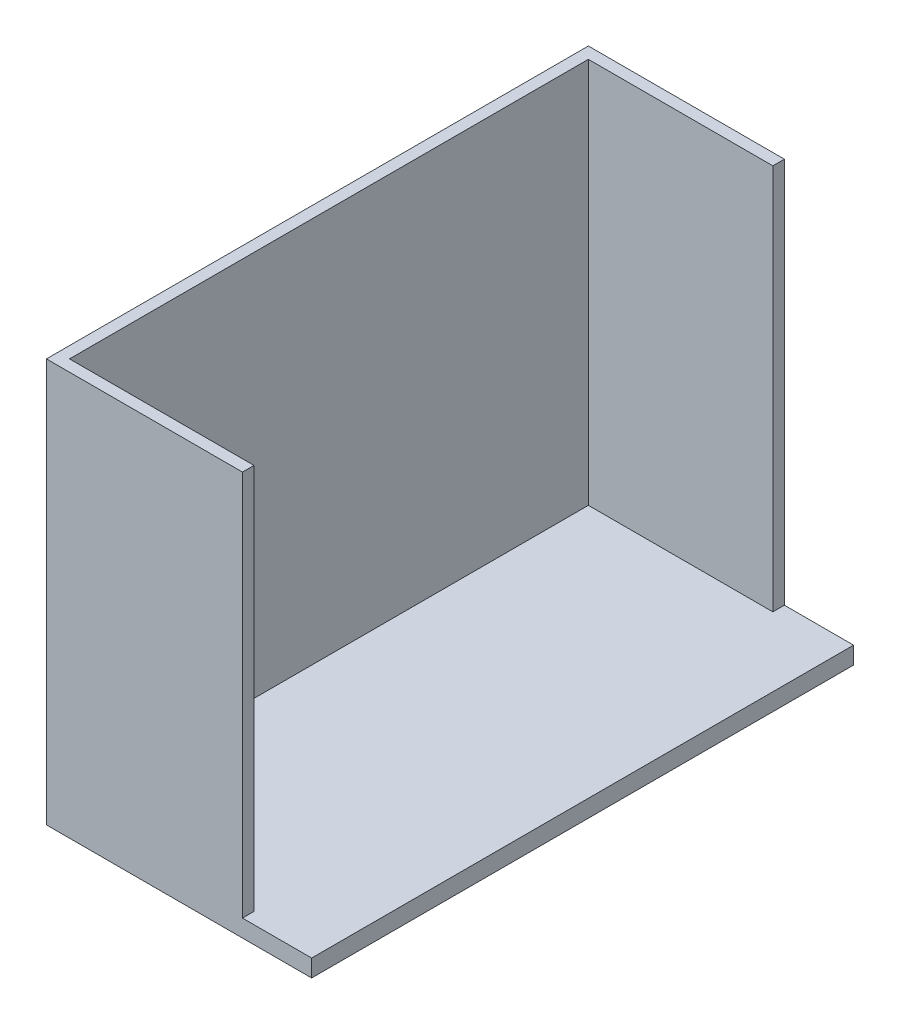
ISO-10303-21;
HEADER;
FILE_DESCRIPTION(('STEP AP214'),'2;1');
FILE_NAME('part.step','',(''),(''),'','','');
FILE_SCHEMA(('AUTOMOTIVE_DESIGN { 1 0 10303 214 1 1 1 1 }'));
ENDSEC;
DATA;
#1=APPLICATION_CONTEXT('core data for automotive mechanical design processes');
#2=APPLICATION_PROTOCOL_DEFINITION('international standard','automotive_design',2000,#1);
#3=PRODUCT_CONTEXT('',#1,'mechanical');
#4=PRODUCT('Part','Part','',(#3));
#5=PRODUCT_RELATED_PRODUCT_CATEGORY('part','',(#4));
#6=PRODUCT_DEFINITION_FORMATION('','',#4);
#7=PRODUCT_DEFINITION_CONTEXT('part definition',#1,'design');
#8=PRODUCT_DEFINITION('design','',#6,#7);
#9=PRODUCT_DEFINITION_SHAPE('','',#8);
#10=(LENGTH_UNIT() NAMED_UNIT(*) SI_UNIT(.MILLI.,.METRE.));
#11=(NAMED_UNIT(*) PLANE_ANGLE_UNIT() SI_UNIT($,.RADIAN.));
#12=(NAMED_UNIT(*) SI_UNIT($,.STERADIAN.) SOLID_ANGLE_UNIT());
#13=UNCERTAINTY_MEASURE_WITH_UNIT(LENGTH_MEASURE(1.E-05),#10,'distance_accuracy_value','');
#14=(GEOMETRIC_REPRESENTATION_CONTEXT(3) GLOBAL_UNCERTAINTY_ASSIGNED_CONTEXT((#13)) GLOBAL_UNIT_ASSIGNED_CONTEXT((#10,
#11,#12)) REPRESENTATION_CONTEXT('',''));
#15=CARTESIAN_POINT('',(0.,0.,0.));
#16=DIRECTION('',(0.,0.,1.));
#17=DIRECTION('',(1.,0.,0.));
#18=AXIS2_PLACEMENT_3D('',#15,#16,#17);
#19=CARTESIAN_POINT('',(0.,19.05,0.));
#20=DIRECTION('',(0.,-1.,0.));
#21=DIRECTION('',(0.,0.,-1.));
#22=AXIS2_PLACEMENT_3D('',#19,#20,#21);
#23=PLANE('',#22);
#24=DIRECTION('',(0.,0.,-1.));
#25=VECTOR('',#24,1.);
#26=CARTESIAN_POINT('',(69.85,19.05,-298.45));
#27=LINE('',#26,#25);
#28=CARTESIAN_POINT('',(69.85,19.05,-285.75));
#29=VERTEX_POINT('',#28);
#30=CARTESIAN_POINT('',(69.85,19.05,-298.45));
#31=VERTEX_POINT('',#30);
#32=EDGE_CURVE('E48',#29,#31,#27,.T.);
#33=ORIENTED_EDGE('',*,*,#32,.F.);
#34=DIRECTION('',(1.,0.,0.));
#35=VECTOR('',#34,1.);
#36=CARTESIAN_POINT('',(69.85,19.05,-285.75));
#37=LINE('',#36,#35);
#38=CARTESIAN_POINT('',(-133.35,19.05,-285.75));
#39=VERTEX_POINT('',#38);
#40=EDGE_CURVE('E52',#39,#29,#37,.T.);
#41=ORIENTED_EDGE('',*,*,#40,.F.);
#42=DIRECTION('',(0.,0.,-1.));
#43=VECTOR('',#42,1.);
#44=CARTESIAN_POINT('',(-133.35,19.05,-285.75));
#45=LINE('',#44,#43);
#46=CARTESIAN_POINT('',(-133.35,19.05,285.75));
#47=VERTEX_POINT('',#46);
#48=EDGE_CURVE('E175',#47,#39,#45,.T.);
#49=ORIENTED_EDGE('',*,*,#48,.F.);
#50=DIRECTION('',(-1.,0.,0.));
#51=VECTOR('',#50,1.);
#52=CARTESIAN_POINT('',(69.85,19.05,285.75));
#53=LINE('',#52,#51);
#54=CARTESIAN_POINT('',(69.85,19.05,285.75));
#55=VERTEX_POINT('',#54);
#56=EDGE_CURVE('E173',#55,#47,#53,.T.);
#57=ORIENTED_EDGE('',*,*,#56,.F.);
#58=DIRECTION('',(0.,0.,-1.));
#59=VECTOR('',#58,1.);
#60=CARTESIAN_POINT('',(69.85,19.05,298.45));
#61=LINE('',#60,#59);
#62=CARTESIAN_POINT('',(69.85,19.05,298.45));
#63=VERTEX_POINT('',#62);
#64=EDGE_CURVE('E171',#63,#55,#61,.T.);
#65=ORIENTED_EDGE('',*,*,#64,.F.);
#66=DIRECTION('',(1.,0.,0.));
#67=VECTOR('',#66,1.);
#68=CARTESIAN_POINT('',(-146.05,19.05,298.45));
#69=LINE('',#68,#67);
#70=CARTESIAN_POINT('',(146.05,19.05,298.45));
#71=VERTEX_POINT('',#70);
#72=EDGE_CURVE('E133',#63,#71,#69,.T.);
#73=ORIENTED_EDGE('',*,*,#72,.T.);
#74=DIRECTION('',(0.,0.,-1.));
#75=VECTOR('',#74,1.);
#76=CARTESIAN_POINT('',(146.05,19.05,298.45));
#77=LINE('',#76,#75);
#78=CARTESIAN_POINT('',(146.05,19.05,-298.45));
#79=VERTEX_POINT('',#78);
#80=EDGE_CURVE('E143',#71,#79,#77,.T.);
#81=ORIENTED_EDGE('',*,*,#80,.T.);
#82=DIRECTION('',(-1.,0.,0.));
#83=VECTOR('',#82,1.);
#84=CARTESIAN_POINT('',(-146.05,19.05,-298.45));
#85=LINE('',#84,#83);
#86=EDGE_CURVE('E146',#79,#31,#85,.T.);
#87=ORIENTED_EDGE('',*,*,#86,.T.);
#88=EDGE_LOOP('',(#33,#41,#49,#57,#65,#73,#81,#87));
#89=FACE_BOUND('',#88,.T.);
#90=ADVANCED_FACE('F33',(#89),#23,.F.);
#91=CARTESIAN_POINT('',(146.05,19.05,298.45));
#92=DIRECTION('',(-1.,0.,0.));
#93=DIRECTION('',(0.,0.,1.));
#94=AXIS2_PLACEMENT_3D('',#91,#92,#93);
#95=PLANE('',#94);
#96=DIRECTION('',(0.,0.,-1.));
#97=VECTOR('',#96,1.);
#98=CARTESIAN_POINT('',(146.05,0.,298.45));
#99=LINE('',#98,#97);
#100=CARTESIAN_POINT('',(146.05,0.,298.45));
#101=VERTEX_POINT('',#100);
#102=CARTESIAN_POINT('',(146.05,0.,-298.45));
#103=VERTEX_POINT('',#102);
#104=EDGE_CURVE('E134',#101,#103,#99,.T.);
#105=ORIENTED_EDGE('',*,*,#104,.T.);
#106=DIRECTION('',(0.,-1.,0.));
#107=VECTOR('',#106,1.);
#108=CARTESIAN_POINT('',(146.05,19.05,-298.45));
#109=LINE('',#108,#107);
#110=EDGE_CURVE('E11',#79,#103,#109,.T.);
#111=ORIENTED_EDGE('',*,*,#110,.F.);
#112=ORIENTED_EDGE('',*,*,#80,.F.);
#113=DIRECTION('',(0.,-1.,0.));
#114=VECTOR('',#113,1.);
#115=CARTESIAN_POINT('',(146.05,19.05,298.45));
#116=LINE('',#115,#114);
#117=EDGE_CURVE('E149',#71,#101,#116,.T.);
#118=ORIENTED_EDGE('',*,*,#117,.T.);
#119=EDGE_LOOP('',(#105,#111,#112,#118));
#120=FACE_BOUND('',#119,.T.);
#121=ADVANCED_FACE('F35',(#120),#95,.F.);
#122=CARTESIAN_POINT('',(-146.05,19.05,-298.45));
#123=DIRECTION('',(0.,0.,1.));
#124=DIRECTION('',(1.,0.,0.));
#125=AXIS2_PLACEMENT_3D('',#122,#123,#124);
#126=PLANE('',#125);
#127=DIRECTION('',(-1.,0.,0.));
#128=VECTOR('',#127,1.);
#129=CARTESIAN_POINT('',(-146.05,0.,-298.45));
#130=LINE('',#129,#128);
#131=CARTESIAN_POINT('',(-146.05,0.,-298.45));
#132=VERTEX_POINT('',#131);
#133=EDGE_CURVE('E137',#103,#132,#130,.T.);
#134=ORIENTED_EDGE('',*,*,#133,.T.);
#135=DIRECTION('',(0.,-1.,0.));
#136=VECTOR('',#135,1.);
#137=CARTESIAN_POINT('',(-146.05,19.05,-298.45));
#138=LINE('',#137,#136);
#139=CARTESIAN_POINT('',(-146.05,444.5,-298.45));
#140=VERTEX_POINT('',#139);
#141=EDGE_CURVE('E41',#140,#132,#138,.T.);
#142=ORIENTED_EDGE('',*,*,#141,.F.);
#143=DIRECTION('',(-1.,0.,0.));
#144=VECTOR('',#143,1.);
#145=CARTESIAN_POINT('',(-146.05,444.5,-298.45));
#146=LINE('',#145,#144);
#147=CARTESIAN_POINT('',(69.85,444.5,-298.45));
#148=VERTEX_POINT('',#147);
#149=EDGE_CURVE('E206',#148,#140,#146,.T.);
#150=ORIENTED_EDGE('',*,*,#149,.F.);
#151=DIRECTION('',(0.,-1.,0.));
#152=VECTOR('',#151,1.);
#153=CARTESIAN_POINT('',(69.85,444.5,-298.45));
#154=LINE('',#153,#152);
#155=EDGE_CURVE('E183',#148,#31,#154,.T.);
#156=ORIENTED_EDGE('',*,*,#155,.T.);
#157=ORIENTED_EDGE('',*,*,#86,.F.);
#158=ORIENTED_EDGE('',*,*,#110,.T.);
#159=EDGE_LOOP('',(#134,#142,#150,#156,#157,#158));
#160=FACE_BOUND('',#159,.T.);
#161=ADVANCED_FACE('F209',(#160),#126,.F.);
#162=CARTESIAN_POINT('',(-146.05,19.05,298.45));
#163=DIRECTION('',(1.,0.,0.));
#164=DIRECTION('',(0.,0.,-1.));
#165=AXIS2_PLACEMENT_3D('',#162,#163,#164);
#166=PLANE('',#165);
#167=DIRECTION('',(0.,0.,1.));
#168=VECTOR('',#167,1.);
#169=CARTESIAN_POINT('',(-146.05,0.,298.45));
#170=LINE('',#169,#168);
#171=CARTESIAN_POINT('',(-146.05,0.,298.45));
#172=VERTEX_POINT('',#171);
#173=EDGE_CURVE('E152',#132,#172,#170,.T.);
#174=ORIENTED_EDGE('',*,*,#173,.T.);
#175=DIRECTION('',(0.,-1.,0.));
#176=VECTOR('',#175,1.);
#177=CARTESIAN_POINT('',(-146.05,19.05,298.45));
#178=LINE('',#177,#176);
#179=CARTESIAN_POINT('',(-146.05,444.5,298.45));
#180=VERTEX_POINT('',#179);
#181=EDGE_CURVE('E157',#180,#172,#178,.T.);
#182=ORIENTED_EDGE('',*,*,#181,.F.);
#183=DIRECTION('',(0.,0.,1.));
#184=VECTOR('',#183,1.);
#185=CARTESIAN_POINT('',(-146.05,444.5,298.45));
#186=LINE('',#185,#184);
#187=EDGE_CURVE('E126',#140,#180,#186,.T.);
#188=ORIENTED_EDGE('',*,*,#187,.F.);
#189=ORIENTED_EDGE('',*,*,#141,.T.);
#190=EDGE_LOOP('',(#174,#182,#188,#189));
#191=FACE_BOUND('',#190,.T.);
#192=ADVANCED_FACE('F161',(#191),#166,.F.);
#193=CARTESIAN_POINT('',(-146.05,19.05,298.45));
#194=DIRECTION('',(0.,0.,-1.));
#195=DIRECTION('',(-1.,0.,0.));
#196=AXIS2_PLACEMENT_3D('',#193,#194,#195);
#197=PLANE('',#196);
#198=DIRECTION('',(1.,0.,0.));
#199=VECTOR('',#198,1.);
#200=CARTESIAN_POINT('',(-146.05,0.,298.45));
#201=LINE('',#200,#199);
#202=EDGE_CURVE('E147',#172,#101,#201,.T.);
#203=ORIENTED_EDGE('',*,*,#202,.T.);
#204=ORIENTED_EDGE('',*,*,#117,.F.);
#205=ORIENTED_EDGE('',*,*,#72,.F.);
#206=DIRECTION('',(0.,-1.,0.));
#207=VECTOR('',#206,1.);
#208=CARTESIAN_POINT('',(69.85,444.5,298.45));
#209=LINE('',#208,#207);
#210=CARTESIAN_POINT('',(69.85,444.5,298.45));
#211=VERTEX_POINT('',#210);
#212=EDGE_CURVE('E113',#211,#63,#209,.T.);
#213=ORIENTED_EDGE('',*,*,#212,.F.);
#214=DIRECTION('',(1.,0.,0.));
#215=VECTOR('',#214,1.);
#216=CARTESIAN_POINT('',(-146.05,444.5,298.45));
#217=LINE('',#216,#215);
#218=EDGE_CURVE('E119',#180,#211,#217,.T.);
#219=ORIENTED_EDGE('',*,*,#218,.F.);
#220=ORIENTED_EDGE('',*,*,#181,.T.);
#221=EDGE_LOOP('',(#203,#204,#205,#213,#219,#220));
#222=FACE_BOUND('',#221,.T.);
#223=ADVANCED_FACE('F131',(#222),#197,.F.);
#224=CARTESIAN_POINT('',(0.,0.,0.));
#225=DIRECTION('',(0.,-1.,0.));
#226=DIRECTION('',(0.,0.,-1.));
#227=AXIS2_PLACEMENT_3D('',#224,#225,#226);
#228=PLANE('',#227);
#229=ORIENTED_EDGE('',*,*,#104,.F.);
#230=ORIENTED_EDGE('',*,*,#202,.F.);
#231=ORIENTED_EDGE('',*,*,#173,.F.);
#232=ORIENTED_EDGE('',*,*,#133,.F.);
#233=EDGE_LOOP('',(#229,#230,#231,#232));
#234=FACE_BOUND('',#233,.T.);
#235=ADVANCED_FACE('F167',(#234),#228,.T.);
#236=CARTESIAN_POINT('',(69.85,444.5,298.45));
#237=DIRECTION('',(-1.,0.,0.));
#238=DIRECTION('',(0.,0.,1.));
#239=AXIS2_PLACEMENT_3D('',#236,#237,#238);
#240=PLANE('',#239);
#241=ORIENTED_EDGE('',*,*,#64,.T.);
#242=DIRECTION('',(0.,-1.,0.));
#243=VECTOR('',#242,1.);
#244=CARTESIAN_POINT('',(69.85,444.5,285.75));
#245=LINE('',#244,#243);
#246=CARTESIAN_POINT('',(69.85,444.5,285.75));
#247=VERTEX_POINT('',#246);
#248=EDGE_CURVE('E115',#247,#55,#245,.T.);
#249=ORIENTED_EDGE('',*,*,#248,.F.);
#250=DIRECTION('',(0.,0.,-1.));
#251=VECTOR('',#250,1.);
#252=CARTESIAN_POINT('',(69.85,444.5,298.45));
#253=LINE('',#252,#251);
#254=EDGE_CURVE('E108',#211,#247,#253,.T.);
#255=ORIENTED_EDGE('',*,*,#254,.F.);
#256=ORIENTED_EDGE('',*,*,#212,.T.);
#257=EDGE_LOOP('',(#241,#249,#255,#256));
#258=FACE_BOUND('',#257,.T.);
#259=ADVANCED_FACE('F111',(#258),#240,.F.);
#260=CARTESIAN_POINT('',(69.85,444.5,285.75));
#261=DIRECTION('',(0.,0.,1.));
#262=DIRECTION('',(1.,0.,0.));
#263=AXIS2_PLACEMENT_3D('',#260,#261,#262);
#264=PLANE('',#263);
#265=ORIENTED_EDGE('',*,*,#56,.T.);
#266=DIRECTION('',(0.,-1.,0.));
#267=VECTOR('',#266,1.);
#268=CARTESIAN_POINT('',(-133.35,444.5,285.75));
#269=LINE('',#268,#267);
#270=CARTESIAN_POINT('',(-133.35,444.5,285.75));
#271=VERTEX_POINT('',#270);
#272=EDGE_CURVE('E139',#271,#47,#269,.T.);
#273=ORIENTED_EDGE('',*,*,#272,.F.);
#274=DIRECTION('',(-1.,0.,0.));
#275=VECTOR('',#274,1.);
#276=CARTESIAN_POINT('',(69.85,444.5,285.75));
#277=LINE('',#276,#275);
#278=EDGE_CURVE('E118',#247,#271,#277,.T.);
#279=ORIENTED_EDGE('',*,*,#278,.F.);
#280=ORIENTED_EDGE('',*,*,#248,.T.);
#281=EDGE_LOOP('',(#265,#273,#279,#280));
#282=FACE_BOUND('',#281,.T.);
#283=ADVANCED_FACE('F199',(#282),#264,.F.);
#284=CARTESIAN_POINT('',(-133.35,444.5,-285.75));
#285=DIRECTION('',(-1.,0.,0.));
#286=DIRECTION('',(0.,0.,1.));
#287=AXIS2_PLACEMENT_3D('',#284,#285,#286);
#288=PLANE('',#287);
#289=ORIENTED_EDGE('',*,*,#48,.T.);
#290=DIRECTION('',(0.,-1.,0.));
#291=VECTOR('',#290,1.);
#292=CARTESIAN_POINT('',(-133.35,444.5,-285.75));
#293=LINE('',#292,#291);
#294=CARTESIAN_POINT('',(-133.35,444.5,-285.75));
#295=VERTEX_POINT('',#294);
#296=EDGE_CURVE('E189',#295,#39,#293,.T.);
#297=ORIENTED_EDGE('',*,*,#296,.F.);
#298=DIRECTION('',(0.,0.,-1.));
#299=VECTOR('',#298,1.);
#300=CARTESIAN_POINT('',(-133.35,444.5,-285.75));
#301=LINE('',#300,#299);
#302=EDGE_CURVE('E197',#271,#295,#301,.T.);
#303=ORIENTED_EDGE('',*,*,#302,.F.);
#304=ORIENTED_EDGE('',*,*,#272,.T.);
#305=EDGE_LOOP('',(#289,#297,#303,#304));
#306=FACE_BOUND('',#305,.T.);
#307=ADVANCED_FACE('F195',(#306),#288,.F.);
#308=CARTESIAN_POINT('',(69.85,444.5,-285.75));
#309=DIRECTION('',(0.,0.,-1.));
#310=DIRECTION('',(-1.,0.,0.));
#311=AXIS2_PLACEMENT_3D('',#308,#309,#310);
#312=PLANE('',#311);
#313=ORIENTED_EDGE('',*,*,#40,.T.);
#314=DIRECTION('',(0.,-1.,0.));
#315=VECTOR('',#314,1.);
#316=CARTESIAN_POINT('',(69.85,444.5,-285.75));
#317=LINE('',#316,#315);
#318=CARTESIAN_POINT('',(69.85,444.5,-285.75));
#319=VERTEX_POINT('',#318);
#320=EDGE_CURVE('E186',#319,#29,#317,.T.);
#321=ORIENTED_EDGE('',*,*,#320,.F.);
#322=DIRECTION('',(1.,0.,0.));
#323=VECTOR('',#322,1.);
#324=CARTESIAN_POINT('',(69.85,444.5,-285.75));
#325=LINE('',#324,#323);
#326=EDGE_CURVE('E201',#295,#319,#325,.T.);
#327=ORIENTED_EDGE('',*,*,#326,.F.);
#328=ORIENTED_EDGE('',*,*,#296,.T.);
#329=EDGE_LOOP('',(#313,#321,#327,#328));
#330=FACE_BOUND('',#329,.T.);
#331=ADVANCED_FACE('F215',(#330),#312,.F.);
#332=CARTESIAN_POINT('',(69.85,444.5,-298.45));
#333=DIRECTION('',(-1.,0.,0.));
#334=DIRECTION('',(0.,0.,1.));
#335=AXIS2_PLACEMENT_3D('',#332,#333,#334);
#336=PLANE('',#335);
#337=ORIENTED_EDGE('',*,*,#32,.T.);
#338=ORIENTED_EDGE('',*,*,#155,.F.);
#339=DIRECTION('',(0.,0.,-1.));
#340=VECTOR('',#339,1.);
#341=CARTESIAN_POINT('',(69.85,444.5,-298.45));
#342=LINE('',#341,#340);
#343=EDGE_CURVE('E205',#319,#148,#342,.T.);
#344=ORIENTED_EDGE('',*,*,#343,.F.);
#345=ORIENTED_EDGE('',*,*,#320,.T.);
#346=EDGE_LOOP('',(#337,#338,#344,#345));
#347=FACE_BOUND('',#346,.T.);
#348=ADVANCED_FACE('F211',(#347),#336,.F.);
#349=CARTESIAN_POINT('',(0.,444.5,0.));
#350=DIRECTION('',(0.,1.,0.));
#351=DIRECTION('',(0.,0.,1.));
#352=AXIS2_PLACEMENT_3D('',#349,#350,#351);
#353=PLANE('',#352);
#354=ORIENTED_EDGE('',*,*,#218,.T.);
#355=ORIENTED_EDGE('',*,*,#254,.T.);
#356=ORIENTED_EDGE('',*,*,#278,.T.);
#357=ORIENTED_EDGE('',*,*,#302,.T.);
#358=ORIENTED_EDGE('',*,*,#326,.T.);
#359=ORIENTED_EDGE('',*,*,#343,.T.);
#360=ORIENTED_EDGE('',*,*,#149,.T.);
#361=ORIENTED_EDGE('',*,*,#187,.T.);
#362=EDGE_LOOP('',(#354,#355,#356,#357,#358,#359,#360,#361));
#363=FACE_BOUND('',#362,.T.);
#364=ADVANCED_FACE('F123',(#363),#353,.T.);
#365=CLOSED_SHELL('',(#90,#121,#161,#192,#223,#235,#259,#283,#307,#331,#348,#364));
#366=MANIFOLD_SOLID_BREP('B2',#365);
#367=ADVANCED_BREP_SHAPE_REPRESENTATION('',(#18,#366),#14);
#368=SHAPE_DEFINITION_REPRESENTATION(#9,#367);
ENDSEC;
END-ISO-10303-21;
